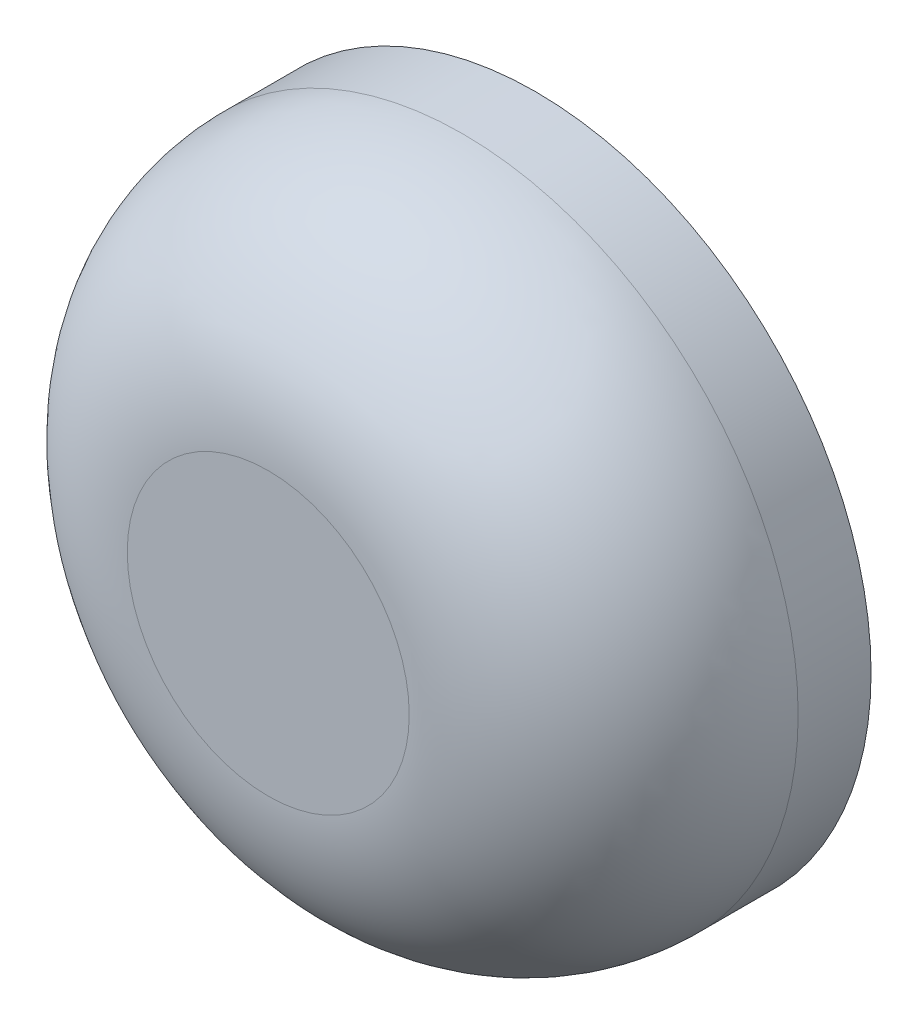
ISO-10303-21;
HEADER;
FILE_DESCRIPTION(('STEP AP214'),'2;1');
FILE_NAME('part.step','',(''),(''),'','','');
FILE_SCHEMA(('AUTOMOTIVE_DESIGN { 1 0 10303 214 1 1 1 1 }'));
ENDSEC;
DATA;
#1=APPLICATION_CONTEXT('core data for automotive mechanical design processes');
#2=APPLICATION_PROTOCOL_DEFINITION('international standard','automotive_design',2000,#1);
#3=PRODUCT_CONTEXT('',#1,'mechanical');
#4=PRODUCT('Part','Part','',(#3));
#5=PRODUCT_RELATED_PRODUCT_CATEGORY('part','',(#4));
#6=PRODUCT_DEFINITION_FORMATION('','',#4);
#7=PRODUCT_DEFINITION_CONTEXT('part definition',#1,'design');
#8=PRODUCT_DEFINITION('design','',#6,#7);
#9=PRODUCT_DEFINITION_SHAPE('','',#8);
#10=(LENGTH_UNIT() NAMED_UNIT(*) SI_UNIT(.MILLI.,.METRE.));
#11=(NAMED_UNIT(*) PLANE_ANGLE_UNIT() SI_UNIT($,.RADIAN.));
#12=(NAMED_UNIT(*) SI_UNIT($,.STERADIAN.) SOLID_ANGLE_UNIT());
#13=UNCERTAINTY_MEASURE_WITH_UNIT(LENGTH_MEASURE(1.E-05),#10,'distance_accuracy_value','');
#14=(GEOMETRIC_REPRESENTATION_CONTEXT(3) GLOBAL_UNCERTAINTY_ASSIGNED_CONTEXT((#13)) GLOBAL_UNIT_ASSIGNED_CONTEXT((#10,
#11,#12)) REPRESENTATION_CONTEXT('',''));
#15=CARTESIAN_POINT('',(0.,0.,0.));
#16=DIRECTION('',(0.,0.,1.));
#17=DIRECTION('',(1.,0.,0.));
#18=AXIS2_PLACEMENT_3D('',#15,#16,#17);
#19=CARTESIAN_POINT('',(0.,0.,0.));
#20=DIRECTION('',(0.,0.,1.));
#21=DIRECTION('',(1.,0.,0.));
#22=AXIS2_PLACEMENT_3D('',#19,#20,#21);
#23=PLANE('',#22);
#24=CARTESIAN_POINT('',(0.,0.,0.));
#25=DIRECTION('',(0.,0.,1.));
#26=DIRECTION('',(1.,0.,0.));
#27=AXIS2_PLACEMENT_3D('',#24,#25,#26);
#28=CIRCLE('',#27,69.);
#29=CARTESIAN_POINT('',(69.,0.,0.));
#30=VERTEX_POINT('',#29);
#31=EDGE_CURVE('E54',#30,#30,#28,.T.);
#32=ORIENTED_EDGE('',*,*,#31,.F.);
#33=EDGE_LOOP('',(#32));
#34=FACE_BOUND('',#33,.T.);
#35=CARTESIAN_POINT('',(0.,0.,0.));
#36=DIRECTION('',(0.,0.,1.));
#37=DIRECTION('',(1.,0.,0.));
#38=AXIS2_PLACEMENT_3D('',#35,#36,#37);
#39=CIRCLE('',#38,66.5);
#40=CARTESIAN_POINT('',(66.5,0.,0.));
#41=VERTEX_POINT('',#40);
#42=EDGE_CURVE('E59',#41,#41,#39,.T.);
#43=ORIENTED_EDGE('',*,*,#42,.T.);
#44=EDGE_LOOP('',(#43));
#45=FACE_BOUND('',#44,.T.);
#46=ADVANCED_FACE('F41',(#34,#45),#23,.F.);
#47=CARTESIAN_POINT('',(0.,0.,10.));
#48=DIRECTION('',(0.,0.,-1.));
#49=DIRECTION('',(-1.,0.,0.));
#50=AXIS2_PLACEMENT_3D('',#47,#48,#49);
#51=CYLINDRICAL_SURFACE('',#50,69.);
#52=CARTESIAN_POINT('',(0.,0.,15.));
#53=DIRECTION('',(0.,0.,1.));
#54=DIRECTION('',(1.,0.,0.));
#55=AXIS2_PLACEMENT_3D('',#52,#53,#54);
#56=CIRCLE('',#55,69.);
#57=CARTESIAN_POINT('',(69.,0.,15.));
#58=VERTEX_POINT('',#57);
#59=EDGE_CURVE('E10',#58,#58,#56,.F.);
#60=ORIENTED_EDGE('',*,*,#59,.T.);
#61=EDGE_LOOP('',(#60));
#62=FACE_BOUND('',#61,.T.);
#63=ORIENTED_EDGE('',*,*,#31,.T.);
#64=EDGE_LOOP('',(#63));
#65=FACE_BOUND('',#64,.T.);
#66=ADVANCED_FACE('F80',(#62,#65),#51,.T.);
#67=CARTESIAN_POINT('',(0.,0.,10.));
#68=DIRECTION('',(0.,0.,-1.));
#69=DIRECTION('',(-1.,0.,0.));
#70=AXIS2_PLACEMENT_3D('',#67,#68,#69);
#71=CYLINDRICAL_SURFACE('',#70,66.5);
#72=ORIENTED_EDGE('',*,*,#42,.F.);
#73=EDGE_LOOP('',(#72));
#74=FACE_BOUND('',#73,.T.);
#75=CARTESIAN_POINT('',(0.,0.,15.));
#76=DIRECTION('',(0.,0.,-1.));
#77=DIRECTION('',(-1.,0.,0.));
#78=AXIS2_PLACEMENT_3D('',#75,#76,#77);
#79=CIRCLE('',#78,66.5);
#80=CARTESIAN_POINT('',(-66.5,0.,15.));
#81=VERTEX_POINT('',#80);
#82=EDGE_CURVE('E65',#81,#81,#79,.T.);
#83=ORIENTED_EDGE('',*,*,#82,.F.);
#84=EDGE_LOOP('',(#83));
#85=FACE_BOUND('',#84,.T.);
#86=ADVANCED_FACE('F77',(#74,#85),#71,.F.);
#87=CARTESIAN_POINT('',(0.,0.,55.));
#88=DIRECTION('',(0.,0.,1.));
#89=DIRECTION('',(1.,0.,0.));
#90=AXIS2_PLACEMENT_3D('',#87,#88,#89);
#91=PLANE('',#90);
#92=CARTESIAN_POINT('',(0.,0.,55.));
#93=DIRECTION('',(0.,0.,1.));
#94=DIRECTION('',(1.,0.,0.));
#95=AXIS2_PLACEMENT_3D('',#92,#93,#94);
#96=CIRCLE('',#95,29.);
#97=CARTESIAN_POINT('',(29.,0.,55.));
#98=VERTEX_POINT('',#97);
#99=EDGE_CURVE('E49',#98,#98,#96,.T.);
#100=ORIENTED_EDGE('',*,*,#99,.T.);
#101=EDGE_LOOP('',(#100));
#102=FACE_BOUND('',#101,.T.);
#103=ADVANCED_FACE('F79',(#102),#91,.T.);
#104=CARTESIAN_POINT('',(0.,0.,15.));
#105=DIRECTION('',(0.,0.,1.));
#106=DIRECTION('',(1.,0.,0.));
#107=AXIS2_PLACEMENT_3D('',#104,#105,#106);
#108=DEGENERATE_TOROIDAL_SURFACE('',#107,29.,40.,.T.);
#109=ORIENTED_EDGE('',*,*,#59,.F.);
#110=EDGE_LOOP('',(#109));
#111=FACE_BOUND('',#110,.T.);
#112=ORIENTED_EDGE('',*,*,#99,.F.);
#113=EDGE_LOOP('',(#112));
#114=FACE_BOUND('',#113,.T.);
#115=ADVANCED_FACE('F43',(#111,#114),#108,.T.);
#116=CARTESIAN_POINT('',(0.,0.,52.5));
#117=DIRECTION('',(0.,0.,1.));
#118=DIRECTION('',(1.,0.,0.));
#119=AXIS2_PLACEMENT_3D('',#116,#117,#118);
#120=PLANE('',#119);
#121=CARTESIAN_POINT('',(0.,0.,52.5));
#122=DIRECTION('',(0.,0.,1.));
#123=DIRECTION('',(1.,0.,0.));
#124=AXIS2_PLACEMENT_3D('',#121,#122,#123);
#125=CIRCLE('',#124,29.);
#126=CARTESIAN_POINT('',(29.,0.,52.5));
#127=VERTEX_POINT('',#126);
#128=EDGE_CURVE('E66',#127,#127,#125,.T.);
#129=ORIENTED_EDGE('',*,*,#128,.F.);
#130=EDGE_LOOP('',(#129));
#131=FACE_BOUND('',#130,.T.);
#132=ADVANCED_FACE('F117',(#131),#120,.F.);
#133=CARTESIAN_POINT('',(0.,0.,15.));
#134=DIRECTION('',(0.,0.,1.));
#135=DIRECTION('',(1.,0.,0.));
#136=AXIS2_PLACEMENT_3D('',#133,#134,#135);
#137=DEGENERATE_TOROIDAL_SURFACE('',#136,29.,37.5,.T.);
#138=ORIENTED_EDGE('',*,*,#82,.T.);
#139=EDGE_LOOP('',(#138));
#140=FACE_BOUND('',#139,.T.);
#141=ORIENTED_EDGE('',*,*,#128,.T.);
#142=EDGE_LOOP('',(#141));
#143=FACE_BOUND('',#142,.T.);
#144=ADVANCED_FACE('F74',(#140,#143),#137,.F.);
#145=CLOSED_SHELL('',(#46,#66,#86,#103,#115,#132,#144));
#146=MANIFOLD_SOLID_BREP('B2',#145);
#147=ADVANCED_BREP_SHAPE_REPRESENTATION('',(#18,#146),#14);
#148=SHAPE_DEFINITION_REPRESENTATION(#9,#147);
ENDSEC;
END-ISO-10303-21;
